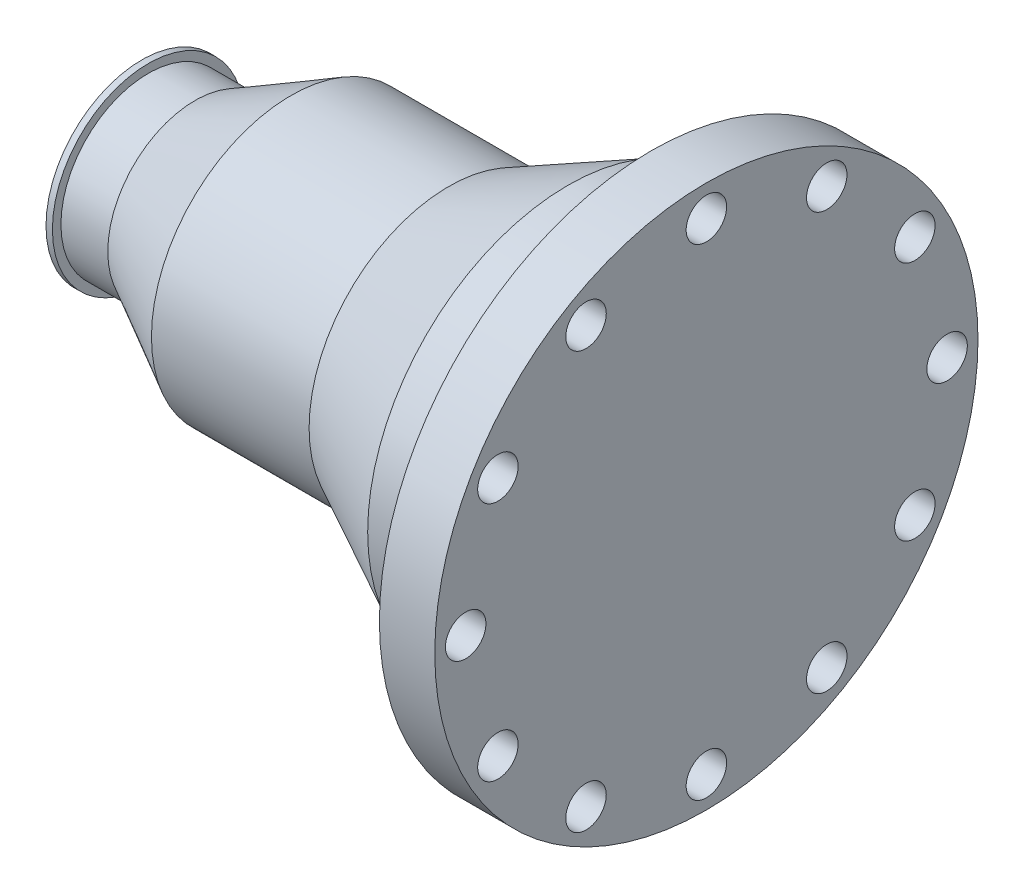
ISO-10303-21;
HEADER;
FILE_DESCRIPTION(('STEP AP214'),'2;1');
FILE_NAME('part.step','',(''),(''),'','','');
FILE_SCHEMA(('AUTOMOTIVE_DESIGN { 1 0 10303 214 1 1 1 1 }'));
ENDSEC;
DATA;
#1=APPLICATION_CONTEXT('core data for automotive mechanical design processes');
#2=APPLICATION_PROTOCOL_DEFINITION('international standard','automotive_design',2000,#1);
#3=PRODUCT_CONTEXT('',#1,'mechanical');
#4=PRODUCT('Part','Part','',(#3));
#5=PRODUCT_RELATED_PRODUCT_CATEGORY('part','',(#4));
#6=PRODUCT_DEFINITION_FORMATION('','',#4);
#7=PRODUCT_DEFINITION_CONTEXT('part definition',#1,'design');
#8=PRODUCT_DEFINITION('design','',#6,#7);
#9=PRODUCT_DEFINITION_SHAPE('','',#8);
#10=(LENGTH_UNIT() NAMED_UNIT(*) SI_UNIT(.MILLI.,.METRE.));
#11=(NAMED_UNIT(*) PLANE_ANGLE_UNIT() SI_UNIT($,.RADIAN.));
#12=(NAMED_UNIT(*) SI_UNIT($,.STERADIAN.) SOLID_ANGLE_UNIT());
#13=UNCERTAINTY_MEASURE_WITH_UNIT(LENGTH_MEASURE(1.E-05),#10,'distance_accuracy_value','');
#14=(GEOMETRIC_REPRESENTATION_CONTEXT(3) GLOBAL_UNCERTAINTY_ASSIGNED_CONTEXT((#13)) GLOBAL_UNIT_ASSIGNED_CONTEXT((#10,
#11,#12)) REPRESENTATION_CONTEXT('',''));
#15=CARTESIAN_POINT('',(0.,0.,0.));
#16=DIRECTION('',(0.,0.,1.));
#17=DIRECTION('',(1.,0.,0.));
#18=AXIS2_PLACEMENT_3D('',#15,#16,#17);
#19=CARTESIAN_POINT('',(0.,0.,0.));
#20=DIRECTION('',(1.,0.,0.));
#21=DIRECTION('',(0.,0.,-1.));
#22=AXIS2_PLACEMENT_3D('',#19,#20,#21);
#23=PLANE('',#22);
#24=CARTESIAN_POINT('',(0.,0.,0.));
#25=DIRECTION('',(-1.,0.,0.));
#26=DIRECTION('',(0.,0.,1.));
#27=AXIS2_PLACEMENT_3D('',#24,#25,#26);
#28=CIRCLE('',#27,31.);
#29=CARTESIAN_POINT('',(0.,0.,31.));
#30=VERTEX_POINT('',#29);
#31=EDGE_CURVE('E80',#30,#30,#28,.T.);
#32=ORIENTED_EDGE('',*,*,#31,.F.);
#33=EDGE_LOOP('',(#32));
#34=FACE_BOUND('',#33,.T.);
#35=CARTESIAN_POINT('',(0.,0.,0.));
#36=DIRECTION('',(-1.,0.,0.));
#37=DIRECTION('',(0.,0.,1.));
#38=AXIS2_PLACEMENT_3D('',#35,#36,#37);
#39=CIRCLE('',#38,45.);
#40=CARTESIAN_POINT('',(0.,0.,45.));
#41=VERTEX_POINT('',#40);
#42=EDGE_CURVE('E10',#41,#41,#39,.T.);
#43=ORIENTED_EDGE('',*,*,#42,.T.);
#44=EDGE_LOOP('',(#43));
#45=FACE_BOUND('',#44,.T.);
#46=ADVANCED_FACE('F37',(#34,#45),#23,.F.);
#47=CARTESIAN_POINT('',(0.,0.,0.));
#48=DIRECTION('',(-1.,0.,0.));
#49=DIRECTION('',(0.,0.,1.));
#50=AXIS2_PLACEMENT_3D('',#47,#48,#49);
#51=CYLINDRICAL_SURFACE('',#50,45.);
#52=ORIENTED_EDGE('',*,*,#42,.F.);
#53=EDGE_LOOP('',(#52));
#54=FACE_BOUND('',#53,.T.);
#55=CARTESIAN_POINT('',(3.,0.,0.));
#56=DIRECTION('',(-1.,0.,0.));
#57=DIRECTION('',(0.,0.,1.));
#58=AXIS2_PLACEMENT_3D('',#55,#56,#57);
#59=CIRCLE('',#58,45.);
#60=CARTESIAN_POINT('',(3.,0.,45.));
#61=VERTEX_POINT('',#60);
#62=EDGE_CURVE('E43',#61,#61,#59,.T.);
#63=ORIENTED_EDGE('',*,*,#62,.T.);
#64=EDGE_LOOP('',(#63));
#65=FACE_BOUND('',#64,.T.);
#66=ADVANCED_FACE('F205',(#54,#65),#51,.T.);
#67=CARTESIAN_POINT('',(3.,45.,0.));
#68=DIRECTION('',(-1.,0.,0.));
#69=DIRECTION('',(0.,0.,1.));
#70=AXIS2_PLACEMENT_3D('',#67,#68,#69);
#71=PLANE('',#70);
#72=ORIENTED_EDGE('',*,*,#62,.F.);
#73=EDGE_LOOP('',(#72));
#74=FACE_BOUND('',#73,.T.);
#75=CARTESIAN_POINT('',(3.,0.,0.));
#76=DIRECTION('',(-1.,0.,0.));
#77=DIRECTION('',(0.,0.,1.));
#78=AXIS2_PLACEMENT_3D('',#75,#76,#77);
#79=CIRCLE('',#78,41.);
#80=CARTESIAN_POINT('',(3.,0.,41.));
#81=VERTEX_POINT('',#80);
#82=EDGE_CURVE('E47',#81,#81,#79,.T.);
#83=ORIENTED_EDGE('',*,*,#82,.T.);
#84=EDGE_LOOP('',(#83));
#85=FACE_BOUND('',#84,.T.);
#86=ADVANCED_FACE('F211',(#74,#85),#71,.F.);
#87=CARTESIAN_POINT('',(0.,0.,0.));
#88=DIRECTION('',(-1.,0.,0.));
#89=DIRECTION('',(0.,0.,1.));
#90=AXIS2_PLACEMENT_3D('',#87,#88,#89);
#91=CYLINDRICAL_SURFACE('',#90,41.);
#92=ORIENTED_EDGE('',*,*,#82,.F.);
#93=EDGE_LOOP('',(#92));
#94=FACE_BOUND('',#93,.T.);
#95=CARTESIAN_POINT('',(25.,0.,0.));
#96=DIRECTION('',(-1.,0.,0.));
#97=DIRECTION('',(0.,0.,1.));
#98=AXIS2_PLACEMENT_3D('',#95,#96,#97);
#99=CIRCLE('',#98,41.);
#100=CARTESIAN_POINT('',(25.,0.,41.));
#101=VERTEX_POINT('',#100);
#102=EDGE_CURVE('E51',#101,#101,#99,.T.);
#103=ORIENTED_EDGE('',*,*,#102,.T.);
#104=EDGE_LOOP('',(#103));
#105=FACE_BOUND('',#104,.T.);
#106=ADVANCED_FACE('F409',(#94,#105),#91,.T.);
#107=CARTESIAN_POINT('',(70.,0.,0.));
#108=DIRECTION('',(1.,0.,0.));
#109=DIRECTION('',(0.,0.,-1.));
#110=AXIS2_PLACEMENT_3D('',#107,#108,#109);
#111=CONICAL_SURFACE('',#110,65.5,0.498567905638218);
#112=ORIENTED_EDGE('',*,*,#102,.F.);
#113=EDGE_LOOP('',(#112));
#114=FACE_BOUND('',#113,.T.);
#115=CARTESIAN_POINT('',(70.,0.,0.));
#116=DIRECTION('',(-1.,0.,0.));
#117=DIRECTION('',(0.,0.,1.));
#118=AXIS2_PLACEMENT_3D('',#115,#116,#117);
#119=CIRCLE('',#118,65.5);
#120=CARTESIAN_POINT('',(70.,0.,65.5));
#121=VERTEX_POINT('',#120);
#122=EDGE_CURVE('E56',#121,#121,#119,.T.);
#123=ORIENTED_EDGE('',*,*,#122,.T.);
#124=EDGE_LOOP('',(#123));
#125=FACE_BOUND('',#124,.T.);
#126=ADVANCED_FACE('F400',(#114,#125),#111,.T.);
#127=CARTESIAN_POINT('',(0.,0.,0.));
#128=DIRECTION('',(-1.,0.,0.));
#129=DIRECTION('',(0.,0.,1.));
#130=AXIS2_PLACEMENT_3D('',#127,#128,#129);
#131=CYLINDRICAL_SURFACE('',#130,65.5);
#132=ORIENTED_EDGE('',*,*,#122,.F.);
#133=EDGE_LOOP('',(#132));
#134=FACE_BOUND('',#133,.T.);
#135=CARTESIAN_POINT('',(144.,0.,0.));
#136=DIRECTION('',(-1.,0.,0.));
#137=DIRECTION('',(0.,0.,1.));
#138=AXIS2_PLACEMENT_3D('',#135,#136,#137);
#139=CIRCLE('',#138,65.5);
#140=CARTESIAN_POINT('',(144.,0.,65.5));
#141=VERTEX_POINT('',#140);
#142=EDGE_CURVE('E59',#141,#141,#139,.T.);
#143=ORIENTED_EDGE('',*,*,#142,.T.);
#144=EDGE_LOOP('',(#143));
#145=FACE_BOUND('',#144,.T.);
#146=ADVANCED_FACE('F391',(#134,#145),#131,.T.);
#147=CARTESIAN_POINT('',(200.,0.,0.));
#148=DIRECTION('',(1.,0.,0.));
#149=DIRECTION('',(0.,0.,-1.));
#150=AXIS2_PLACEMENT_3D('',#147,#148,#149);
#151=CONICAL_SURFACE('',#150,94.,0.470764926542016);
#152=ORIENTED_EDGE('',*,*,#142,.F.);
#153=EDGE_LOOP('',(#152));
#154=FACE_BOUND('',#153,.T.);
#155=CARTESIAN_POINT('',(200.,0.,0.));
#156=DIRECTION('',(-1.,0.,0.));
#157=DIRECTION('',(0.,0.,1.));
#158=AXIS2_PLACEMENT_3D('',#155,#156,#157);
#159=CIRCLE('',#158,94.);
#160=CARTESIAN_POINT('',(200.,0.,94.));
#161=VERTEX_POINT('',#160);
#162=EDGE_CURVE('E62',#161,#161,#159,.T.);
#163=ORIENTED_EDGE('',*,*,#162,.T.);
#164=EDGE_LOOP('',(#163));
#165=FACE_BOUND('',#164,.T.);
#166=ADVANCED_FACE('F382',(#154,#165),#151,.T.);
#167=CARTESIAN_POINT('',(0.,0.,0.));
#168=DIRECTION('',(-1.,0.,0.));
#169=DIRECTION('',(0.,0.,1.));
#170=AXIS2_PLACEMENT_3D('',#167,#168,#169);
#171=CYLINDRICAL_SURFACE('',#170,94.);
#172=ORIENTED_EDGE('',*,*,#162,.F.);
#173=EDGE_LOOP('',(#172));
#174=FACE_BOUND('',#173,.T.);
#175=CARTESIAN_POINT('',(220.,0.,0.));
#176=DIRECTION('',(-1.,0.,0.));
#177=DIRECTION('',(0.,0.,1.));
#178=AXIS2_PLACEMENT_3D('',#175,#176,#177);
#179=CIRCLE('',#178,94.);
#180=CARTESIAN_POINT('',(220.,0.,94.));
#181=VERTEX_POINT('',#180);
#182=EDGE_CURVE('E65',#181,#181,#179,.T.);
#183=ORIENTED_EDGE('',*,*,#182,.T.);
#184=EDGE_LOOP('',(#183));
#185=FACE_BOUND('',#184,.T.);
#186=ADVANCED_FACE('F373',(#174,#185),#171,.T.);
#187=CARTESIAN_POINT('',(220.,94.,0.));
#188=DIRECTION('',(1.,0.,0.));
#189=DIRECTION('',(0.,0.,-1.));
#190=AXIS2_PLACEMENT_3D('',#187,#188,#189);
#191=PLANE('',#190);
#192=ORIENTED_EDGE('',*,*,#182,.F.);
#193=EDGE_LOOP('',(#192));
#194=FACE_BOUND('',#193,.T.);
#195=CARTESIAN_POINT('',(220.,0.,0.));
#196=DIRECTION('',(-1.,0.,0.));
#197=DIRECTION('',(0.,0.,1.));
#198=AXIS2_PLACEMENT_3D('',#195,#196,#197);
#199=CIRCLE('',#198,95.);
#200=CARTESIAN_POINT('',(220.,0.,95.));
#201=VERTEX_POINT('',#200);
#202=EDGE_CURVE('E68',#201,#201,#199,.T.);
#203=ORIENTED_EDGE('',*,*,#202,.T.);
#204=EDGE_LOOP('',(#203));
#205=FACE_BOUND('',#204,.T.);
#206=ADVANCED_FACE('F364',(#194,#205),#191,.F.);
#207=CARTESIAN_POINT('',(0.,0.,0.));
#208=DIRECTION('',(-1.,0.,0.));
#209=DIRECTION('',(0.,0.,1.));
#210=AXIS2_PLACEMENT_3D('',#207,#208,#209);
#211=CYLINDRICAL_SURFACE('',#210,95.);
#212=ORIENTED_EDGE('',*,*,#202,.F.);
#213=EDGE_LOOP('',(#212));
#214=FACE_BOUND('',#213,.T.);
#215=CARTESIAN_POINT('',(239.,0.,0.));
#216=DIRECTION('',(-1.,0.,0.));
#217=DIRECTION('',(0.,0.,1.));
#218=AXIS2_PLACEMENT_3D('',#215,#216,#217);
#219=CIRCLE('',#218,95.);
#220=CARTESIAN_POINT('',(239.,0.,95.));
#221=VERTEX_POINT('',#220);
#222=EDGE_CURVE('E71',#221,#221,#219,.T.);
#223=ORIENTED_EDGE('',*,*,#222,.T.);
#224=EDGE_LOOP('',(#223));
#225=FACE_BOUND('',#224,.T.);
#226=ADVANCED_FACE('F201',(#214,#225),#211,.T.);
#227=CARTESIAN_POINT('',(239.,100.,0.));
#228=DIRECTION('',(1.,0.,0.));
#229=DIRECTION('',(0.,0.,-1.));
#230=AXIS2_PLACEMENT_3D('',#227,#228,#229);
#231=PLANE('',#230);
#232=CARTESIAN_POINT('',(239.,97.8608706276416,-56.5));
#233=DIRECTION('',(1.,0.,0.));
#234=DIRECTION('',(0.,0.,-1.));
#235=AXIS2_PLACEMENT_3D('',#232,#233,#234);
#236=CIRCLE('',#235,9.50000000000001);
#237=CARTESIAN_POINT('',(239.,97.8608706276416,-66.));
#238=VERTEX_POINT('',#237);
#239=EDGE_CURVE('E152',#238,#238,#236,.F.);
#240=ORIENTED_EDGE('',*,*,#239,.F.);
#241=EDGE_LOOP('',(#240));
#242=FACE_BOUND('',#241,.T.);
#243=CARTESIAN_POINT('',(239.,56.4999999999999,-97.8608706276416));
#244=DIRECTION('',(1.,0.,0.));
#245=DIRECTION('',(0.,0.,-1.));
#246=AXIS2_PLACEMENT_3D('',#243,#244,#245);
#247=CIRCLE('',#246,9.5);
#248=CARTESIAN_POINT('',(239.,56.4999999999999,-107.360870627642));
#249=VERTEX_POINT('',#248);
#250=EDGE_CURVE('E146',#249,#249,#247,.F.);
#251=ORIENTED_EDGE('',*,*,#250,.F.);
#252=EDGE_LOOP('',(#251));
#253=FACE_BOUND('',#252,.T.);
#254=CARTESIAN_POINT('',(239.,0.,-113.));
#255=DIRECTION('',(1.,0.,0.));
#256=DIRECTION('',(0.,0.,-1.));
#257=AXIS2_PLACEMENT_3D('',#254,#255,#256);
#258=CIRCLE('',#257,9.49999999999999);
#259=CARTESIAN_POINT('',(239.,0.,-122.5));
#260=VERTEX_POINT('',#259);
#261=EDGE_CURVE('E140',#260,#260,#258,.F.);
#262=ORIENTED_EDGE('',*,*,#261,.F.);
#263=EDGE_LOOP('',(#262));
#264=FACE_BOUND('',#263,.T.);
#265=CARTESIAN_POINT('',(239.,-56.5,-97.8608706276415));
#266=DIRECTION('',(1.,0.,0.));
#267=DIRECTION('',(0.,0.,-1.));
#268=AXIS2_PLACEMENT_3D('',#265,#266,#267);
#269=CIRCLE('',#268,9.5);
#270=CARTESIAN_POINT('',(239.,-56.5,-107.360870627642));
#271=VERTEX_POINT('',#270);
#272=EDGE_CURVE('E134',#271,#271,#269,.F.);
#273=ORIENTED_EDGE('',*,*,#272,.F.);
#274=EDGE_LOOP('',(#273));
#275=FACE_BOUND('',#274,.T.);
#276=CARTESIAN_POINT('',(239.,-97.8608706276416,-56.5));
#277=DIRECTION('',(1.,0.,0.));
#278=DIRECTION('',(0.,0.,-1.));
#279=AXIS2_PLACEMENT_3D('',#276,#277,#278);
#280=CIRCLE('',#279,9.50000000000001);
#281=CARTESIAN_POINT('',(239.,-97.8608706276416,-66.));
#282=VERTEX_POINT('',#281);
#283=EDGE_CURVE('E128',#282,#282,#280,.F.);
#284=ORIENTED_EDGE('',*,*,#283,.F.);
#285=EDGE_LOOP('',(#284));
#286=FACE_BOUND('',#285,.T.);
#287=CARTESIAN_POINT('',(239.,-113.,0.));
#288=DIRECTION('',(1.,0.,0.));
#289=DIRECTION('',(0.,0.,-1.));
#290=AXIS2_PLACEMENT_3D('',#287,#288,#289);
#291=CIRCLE('',#290,9.49999999999998);
#292=CARTESIAN_POINT('',(239.,-113.,-9.49999999999998));
#293=VERTEX_POINT('',#292);
#294=EDGE_CURVE('E122',#293,#293,#291,.F.);
#295=ORIENTED_EDGE('',*,*,#294,.F.);
#296=EDGE_LOOP('',(#295));
#297=FACE_BOUND('',#296,.T.);
#298=CARTESIAN_POINT('',(239.,-97.8608706276415,56.5));
#299=DIRECTION('',(1.,0.,0.));
#300=DIRECTION('',(0.,0.,-1.));
#301=AXIS2_PLACEMENT_3D('',#298,#299,#300);
#302=CIRCLE('',#301,9.5);
#303=CARTESIAN_POINT('',(239.,-97.8608706276415,47.));
#304=VERTEX_POINT('',#303);
#305=EDGE_CURVE('E116',#304,#304,#302,.F.);
#306=ORIENTED_EDGE('',*,*,#305,.F.);
#307=EDGE_LOOP('',(#306));
#308=FACE_BOUND('',#307,.T.);
#309=CARTESIAN_POINT('',(239.,-56.5,97.8608706276416));
#310=DIRECTION('',(1.,0.,0.));
#311=DIRECTION('',(0.,0.,-1.));
#312=AXIS2_PLACEMENT_3D('',#309,#310,#311);
#313=CIRCLE('',#312,9.5);
#314=CARTESIAN_POINT('',(239.,-56.5,88.3608706276416));
#315=VERTEX_POINT('',#314);
#316=EDGE_CURVE('E110',#315,#315,#313,.F.);
#317=ORIENTED_EDGE('',*,*,#316,.F.);
#318=EDGE_LOOP('',(#317));
#319=FACE_BOUND('',#318,.T.);
#320=CARTESIAN_POINT('',(239.,0.,113.));
#321=DIRECTION('',(1.,0.,0.));
#322=DIRECTION('',(0.,0.,-1.));
#323=AXIS2_PLACEMENT_3D('',#320,#321,#322);
#324=CIRCLE('',#323,9.49999999999999);
#325=CARTESIAN_POINT('',(239.,0.,103.5));
#326=VERTEX_POINT('',#325);
#327=EDGE_CURVE('E104',#326,#326,#324,.F.);
#328=ORIENTED_EDGE('',*,*,#327,.F.);
#329=EDGE_LOOP('',(#328));
#330=FACE_BOUND('',#329,.T.);
#331=CARTESIAN_POINT('',(239.,56.5,97.8608706276416));
#332=DIRECTION('',(1.,0.,0.));
#333=DIRECTION('',(0.,0.,-1.));
#334=AXIS2_PLACEMENT_3D('',#331,#332,#333);
#335=CIRCLE('',#334,9.5);
#336=CARTESIAN_POINT('',(239.,56.5,88.3608706276416));
#337=VERTEX_POINT('',#336);
#338=EDGE_CURVE('E98',#337,#337,#335,.F.);
#339=ORIENTED_EDGE('',*,*,#338,.F.);
#340=EDGE_LOOP('',(#339));
#341=FACE_BOUND('',#340,.T.);
#342=CARTESIAN_POINT('',(239.,97.8608706276416,56.5));
#343=DIRECTION('',(1.,0.,0.));
#344=DIRECTION('',(0.,0.,-1.));
#345=AXIS2_PLACEMENT_3D('',#342,#343,#344);
#346=CIRCLE('',#345,9.5);
#347=CARTESIAN_POINT('',(239.,97.8608706276416,47.));
#348=VERTEX_POINT('',#347);
#349=EDGE_CURVE('E92',#348,#348,#346,.F.);
#350=ORIENTED_EDGE('',*,*,#349,.F.);
#351=EDGE_LOOP('',(#350));
#352=FACE_BOUND('',#351,.T.);
#353=CARTESIAN_POINT('',(239.,113.,0.));
#354=DIRECTION('',(1.,0.,0.));
#355=DIRECTION('',(0.,0.,-1.));
#356=AXIS2_PLACEMENT_3D('',#353,#354,#355);
#357=CIRCLE('',#356,9.50000000000001);
#358=CARTESIAN_POINT('',(239.,113.,-9.50000000000001));
#359=VERTEX_POINT('',#358);
#360=EDGE_CURVE('E86',#359,#359,#357,.F.);
#361=ORIENTED_EDGE('',*,*,#360,.F.);
#362=EDGE_LOOP('',(#361));
#363=FACE_BOUND('',#362,.T.);
#364=ORIENTED_EDGE('',*,*,#222,.F.);
#365=EDGE_LOOP('',(#364));
#366=FACE_BOUND('',#365,.T.);
#367=CARTESIAN_POINT('',(239.,0.,0.));
#368=DIRECTION('',(-1.,0.,0.));
#369=DIRECTION('',(0.,0.,1.));
#370=AXIS2_PLACEMENT_3D('',#367,#368,#369);
#371=CIRCLE('',#370,127.5);
#372=CARTESIAN_POINT('',(239.,0.,127.5));
#373=VERTEX_POINT('',#372);
#374=EDGE_CURVE('E74',#373,#373,#371,.T.);
#375=ORIENTED_EDGE('',*,*,#374,.T.);
#376=EDGE_LOOP('',(#375));
#377=FACE_BOUND('',#376,.T.);
#378=ADVANCED_FACE('F193',(#242,#253,#264,#275,#286,#297,#308,#319,#330,#341,#352,#363,#366,
#377),#231,.F.);
#379=CARTESIAN_POINT('',(0.,0.,0.));
#380=DIRECTION('',(-1.,0.,0.));
#381=DIRECTION('',(0.,0.,1.));
#382=AXIS2_PLACEMENT_3D('',#379,#380,#381);
#383=CYLINDRICAL_SURFACE('',#382,127.5);
#384=ORIENTED_EDGE('',*,*,#374,.F.);
#385=EDGE_LOOP('',(#384));
#386=FACE_BOUND('',#385,.T.);
#387=CARTESIAN_POINT('',(265.,0.,0.));
#388=DIRECTION('',(-1.,0.,0.));
#389=DIRECTION('',(0.,0.,1.));
#390=AXIS2_PLACEMENT_3D('',#387,#388,#389);
#391=CIRCLE('',#390,127.5);
#392=CARTESIAN_POINT('',(265.,0.,127.5));
#393=VERTEX_POINT('',#392);
#394=EDGE_CURVE('E77',#393,#393,#391,.T.);
#395=ORIENTED_EDGE('',*,*,#394,.T.);
#396=EDGE_LOOP('',(#395));
#397=FACE_BOUND('',#396,.T.);
#398=ADVANCED_FACE('F166',(#386,#397),#383,.T.);
#399=CARTESIAN_POINT('',(265.,127.5,0.));
#400=DIRECTION('',(-1.,0.,0.));
#401=DIRECTION('',(0.,0.,1.));
#402=AXIS2_PLACEMENT_3D('',#399,#400,#401);
#403=PLANE('',#402);
#404=CARTESIAN_POINT('',(265.,97.8608706276416,-56.5));
#405=DIRECTION('',(1.,0.,0.));
#406=DIRECTION('',(0.,0.,-1.));
#407=AXIS2_PLACEMENT_3D('',#404,#405,#406);
#408=CIRCLE('',#407,9.50000000000001);
#409=CARTESIAN_POINT('',(265.,97.8608706276416,-66.));
#410=VERTEX_POINT('',#409);
#411=EDGE_CURVE('E155',#410,#410,#408,.T.);
#412=ORIENTED_EDGE('',*,*,#411,.F.);
#413=EDGE_LOOP('',(#412));
#414=FACE_BOUND('',#413,.T.);
#415=CARTESIAN_POINT('',(265.,56.4999999999999,-97.8608706276416));
#416=DIRECTION('',(1.,0.,0.));
#417=DIRECTION('',(0.,0.,-1.));
#418=AXIS2_PLACEMENT_3D('',#415,#416,#417);
#419=CIRCLE('',#418,9.5);
#420=CARTESIAN_POINT('',(265.,56.4999999999999,-107.360870627642));
#421=VERTEX_POINT('',#420);
#422=EDGE_CURVE('E149',#421,#421,#419,.T.);
#423=ORIENTED_EDGE('',*,*,#422,.F.);
#424=EDGE_LOOP('',(#423));
#425=FACE_BOUND('',#424,.T.);
#426=CARTESIAN_POINT('',(265.,0.,-113.));
#427=DIRECTION('',(1.,0.,0.));
#428=DIRECTION('',(0.,0.,-1.));
#429=AXIS2_PLACEMENT_3D('',#426,#427,#428);
#430=CIRCLE('',#429,9.49999999999999);
#431=CARTESIAN_POINT('',(265.,0.,-122.5));
#432=VERTEX_POINT('',#431);
#433=EDGE_CURVE('E143',#432,#432,#430,.T.);
#434=ORIENTED_EDGE('',*,*,#433,.F.);
#435=EDGE_LOOP('',(#434));
#436=FACE_BOUND('',#435,.T.);
#437=CARTESIAN_POINT('',(265.,-56.5,-97.8608706276415));
#438=DIRECTION('',(1.,0.,0.));
#439=DIRECTION('',(0.,0.,-1.));
#440=AXIS2_PLACEMENT_3D('',#437,#438,#439);
#441=CIRCLE('',#440,9.5);
#442=CARTESIAN_POINT('',(265.,-56.5,-107.360870627642));
#443=VERTEX_POINT('',#442);
#444=EDGE_CURVE('E137',#443,#443,#441,.T.);
#445=ORIENTED_EDGE('',*,*,#444,.F.);
#446=EDGE_LOOP('',(#445));
#447=FACE_BOUND('',#446,.T.);
#448=CARTESIAN_POINT('',(265.,-97.8608706276416,-56.5));
#449=DIRECTION('',(1.,0.,0.));
#450=DIRECTION('',(0.,0.,-1.));
#451=AXIS2_PLACEMENT_3D('',#448,#449,#450);
#452=CIRCLE('',#451,9.50000000000001);
#453=CARTESIAN_POINT('',(265.,-97.8608706276416,-66.));
#454=VERTEX_POINT('',#453);
#455=EDGE_CURVE('E131',#454,#454,#452,.T.);
#456=ORIENTED_EDGE('',*,*,#455,.F.);
#457=EDGE_LOOP('',(#456));
#458=FACE_BOUND('',#457,.T.);
#459=CARTESIAN_POINT('',(265.,-113.,0.));
#460=DIRECTION('',(1.,0.,0.));
#461=DIRECTION('',(0.,0.,-1.));
#462=AXIS2_PLACEMENT_3D('',#459,#460,#461);
#463=CIRCLE('',#462,9.49999999999998);
#464=CARTESIAN_POINT('',(265.,-113.,-9.49999999999998));
#465=VERTEX_POINT('',#464);
#466=EDGE_CURVE('E125',#465,#465,#463,.T.);
#467=ORIENTED_EDGE('',*,*,#466,.F.);
#468=EDGE_LOOP('',(#467));
#469=FACE_BOUND('',#468,.T.);
#470=CARTESIAN_POINT('',(265.,-97.8608706276415,56.5));
#471=DIRECTION('',(1.,0.,0.));
#472=DIRECTION('',(0.,0.,-1.));
#473=AXIS2_PLACEMENT_3D('',#470,#471,#472);
#474=CIRCLE('',#473,9.5);
#475=CARTESIAN_POINT('',(265.,-97.8608706276415,47.));
#476=VERTEX_POINT('',#475);
#477=EDGE_CURVE('E119',#476,#476,#474,.T.);
#478=ORIENTED_EDGE('',*,*,#477,.F.);
#479=EDGE_LOOP('',(#478));
#480=FACE_BOUND('',#479,.T.);
#481=CARTESIAN_POINT('',(265.,-56.5,97.8608706276416));
#482=DIRECTION('',(1.,0.,0.));
#483=DIRECTION('',(0.,0.,-1.));
#484=AXIS2_PLACEMENT_3D('',#481,#482,#483);
#485=CIRCLE('',#484,9.5);
#486=CARTESIAN_POINT('',(265.,-56.5,88.3608706276416));
#487=VERTEX_POINT('',#486);
#488=EDGE_CURVE('E113',#487,#487,#485,.T.);
#489=ORIENTED_EDGE('',*,*,#488,.F.);
#490=EDGE_LOOP('',(#489));
#491=FACE_BOUND('',#490,.T.);
#492=CARTESIAN_POINT('',(265.,0.,113.));
#493=DIRECTION('',(1.,0.,0.));
#494=DIRECTION('',(0.,0.,-1.));
#495=AXIS2_PLACEMENT_3D('',#492,#493,#494);
#496=CIRCLE('',#495,9.49999999999999);
#497=CARTESIAN_POINT('',(265.,0.,103.5));
#498=VERTEX_POINT('',#497);
#499=EDGE_CURVE('E107',#498,#498,#496,.T.);
#500=ORIENTED_EDGE('',*,*,#499,.F.);
#501=EDGE_LOOP('',(#500));
#502=FACE_BOUND('',#501,.T.);
#503=CARTESIAN_POINT('',(265.,56.5,97.8608706276416));
#504=DIRECTION('',(1.,0.,0.));
#505=DIRECTION('',(0.,0.,-1.));
#506=AXIS2_PLACEMENT_3D('',#503,#504,#505);
#507=CIRCLE('',#506,9.5);
#508=CARTESIAN_POINT('',(265.,56.5,88.3608706276416));
#509=VERTEX_POINT('',#508);
#510=EDGE_CURVE('E101',#509,#509,#507,.T.);
#511=ORIENTED_EDGE('',*,*,#510,.F.);
#512=EDGE_LOOP('',(#511));
#513=FACE_BOUND('',#512,.T.);
#514=CARTESIAN_POINT('',(265.,97.8608706276416,56.5));
#515=DIRECTION('',(1.,0.,0.));
#516=DIRECTION('',(0.,0.,-1.));
#517=AXIS2_PLACEMENT_3D('',#514,#515,#516);
#518=CIRCLE('',#517,9.5);
#519=CARTESIAN_POINT('',(265.,97.8608706276416,47.));
#520=VERTEX_POINT('',#519);
#521=EDGE_CURVE('E95',#520,#520,#518,.T.);
#522=ORIENTED_EDGE('',*,*,#521,.F.);
#523=EDGE_LOOP('',(#522));
#524=FACE_BOUND('',#523,.T.);
#525=CARTESIAN_POINT('',(265.,113.,0.));
#526=DIRECTION('',(1.,0.,0.));
#527=DIRECTION('',(0.,0.,-1.));
#528=AXIS2_PLACEMENT_3D('',#525,#526,#527);
#529=CIRCLE('',#528,9.50000000000001);
#530=CARTESIAN_POINT('',(265.,113.,-9.50000000000001));
#531=VERTEX_POINT('',#530);
#532=EDGE_CURVE('E89',#531,#531,#529,.T.);
#533=ORIENTED_EDGE('',*,*,#532,.F.);
#534=EDGE_LOOP('',(#533));
#535=FACE_BOUND('',#534,.T.);
#536=ORIENTED_EDGE('',*,*,#394,.F.);
#537=EDGE_LOOP('',(#536));
#538=FACE_BOUND('',#537,.T.);
#539=ADVANCED_FACE('F162',(#414,#425,#436,#447,#458,#469,#480,#491,#502,#513,#524,#535,#538),
#403,.F.);
#540=CARTESIAN_POINT('',(0.,0.,0.));
#541=DIRECTION('',(-1.,0.,0.));
#542=DIRECTION('',(0.,0.,1.));
#543=AXIS2_PLACEMENT_3D('',#540,#541,#542);
#544=CYLINDRICAL_SURFACE('',#543,31.);
#545=ORIENTED_EDGE('',*,*,#31,.T.);
#546=EDGE_LOOP('',(#545));
#547=FACE_BOUND('',#546,.T.);
#548=CARTESIAN_POINT('',(38.,0.,0.));
#549=DIRECTION('',(-1.,0.,0.));
#550=DIRECTION('',(0.,0.,1.));
#551=AXIS2_PLACEMENT_3D('',#548,#549,#550);
#552=CIRCLE('',#551,31.);
#553=CARTESIAN_POINT('',(38.,0.,31.));
#554=VERTEX_POINT('',#553);
#555=EDGE_CURVE('E83',#554,#554,#552,.T.);
#556=ORIENTED_EDGE('',*,*,#555,.F.);
#557=EDGE_LOOP('',(#556));
#558=FACE_BOUND('',#557,.T.);
#559=ADVANCED_FACE('F165',(#547,#558),#544,.F.);
#560=CARTESIAN_POINT('',(38.,31.,0.));
#561=DIRECTION('',(-1.,0.,0.));
#562=DIRECTION('',(0.,0.,1.));
#563=AXIS2_PLACEMENT_3D('',#560,#561,#562);
#564=PLANE('',#563);
#565=ORIENTED_EDGE('',*,*,#555,.T.);
#566=EDGE_LOOP('',(#565));
#567=FACE_BOUND('',#566,.T.);
#568=ADVANCED_FACE('F216',(#567),#564,.T.);
#569=CARTESIAN_POINT('',(265.,113.,0.));
#570=DIRECTION('',(-1.,0.,0.));
#571=DIRECTION('',(0.,0.,1.));
#572=AXIS2_PLACEMENT_3D('',#569,#570,#571);
#573=CYLINDRICAL_SURFACE('',#572,9.50000000000001);
#574=ORIENTED_EDGE('',*,*,#532,.T.);
#575=EDGE_LOOP('',(#574));
#576=FACE_BOUND('',#575,.T.);
#577=ORIENTED_EDGE('',*,*,#360,.T.);
#578=EDGE_LOOP('',(#577));
#579=FACE_BOUND('',#578,.T.);
#580=ADVANCED_FACE('F221',(#576,#579),#573,.F.);
#581=CARTESIAN_POINT('',(265.,97.8608706276416,56.5));
#582=DIRECTION('',(-1.,0.,0.));
#583=DIRECTION('',(0.,0.,1.));
#584=AXIS2_PLACEMENT_3D('',#581,#582,#583);
#585=CYLINDRICAL_SURFACE('',#584,9.5);
#586=ORIENTED_EDGE('',*,*,#521,.T.);
#587=EDGE_LOOP('',(#586));
#588=FACE_BOUND('',#587,.T.);
#589=ORIENTED_EDGE('',*,*,#349,.T.);
#590=EDGE_LOOP('',(#589));
#591=FACE_BOUND('',#590,.T.);
#592=ADVANCED_FACE('F226',(#588,#591),#585,.F.);
#593=CARTESIAN_POINT('',(265.,56.5,97.8608706276416));
#594=DIRECTION('',(-1.,0.,0.));
#595=DIRECTION('',(0.,0.,1.));
#596=AXIS2_PLACEMENT_3D('',#593,#594,#595);
#597=CYLINDRICAL_SURFACE('',#596,9.5);
#598=ORIENTED_EDGE('',*,*,#510,.T.);
#599=EDGE_LOOP('',(#598));
#600=FACE_BOUND('',#599,.T.);
#601=ORIENTED_EDGE('',*,*,#338,.T.);
#602=EDGE_LOOP('',(#601));
#603=FACE_BOUND('',#602,.T.);
#604=ADVANCED_FACE('F232',(#600,#603),#597,.F.);
#605=CARTESIAN_POINT('',(265.,0.,113.));
#606=DIRECTION('',(-1.,0.,0.));
#607=DIRECTION('',(0.,0.,1.));
#608=AXIS2_PLACEMENT_3D('',#605,#606,#607);
#609=CYLINDRICAL_SURFACE('',#608,9.49999999999999);
#610=ORIENTED_EDGE('',*,*,#499,.T.);
#611=EDGE_LOOP('',(#610));
#612=FACE_BOUND('',#611,.T.);
#613=ORIENTED_EDGE('',*,*,#327,.T.);
#614=EDGE_LOOP('',(#613));
#615=FACE_BOUND('',#614,.T.);
#616=ADVANCED_FACE('F236',(#612,#615),#609,.F.);
#617=CARTESIAN_POINT('',(265.,-56.5,97.8608706276416));
#618=DIRECTION('',(-1.,0.,0.));
#619=DIRECTION('',(0.,0.,1.));
#620=AXIS2_PLACEMENT_3D('',#617,#618,#619);
#621=CYLINDRICAL_SURFACE('',#620,9.5);
#622=ORIENTED_EDGE('',*,*,#488,.T.);
#623=EDGE_LOOP('',(#622));
#624=FACE_BOUND('',#623,.T.);
#625=ORIENTED_EDGE('',*,*,#316,.T.);
#626=EDGE_LOOP('',(#625));
#627=FACE_BOUND('',#626,.T.);
#628=ADVANCED_FACE('F240',(#624,#627),#621,.F.);
#629=CARTESIAN_POINT('',(265.,-97.8608706276415,56.5));
#630=DIRECTION('',(-1.,0.,0.));
#631=DIRECTION('',(0.,0.,1.));
#632=AXIS2_PLACEMENT_3D('',#629,#630,#631);
#633=CYLINDRICAL_SURFACE('',#632,9.5);
#634=ORIENTED_EDGE('',*,*,#477,.T.);
#635=EDGE_LOOP('',(#634));
#636=FACE_BOUND('',#635,.T.);
#637=ORIENTED_EDGE('',*,*,#305,.T.);
#638=EDGE_LOOP('',(#637));
#639=FACE_BOUND('',#638,.T.);
#640=ADVANCED_FACE('F244',(#636,#639),#633,.F.);
#641=CARTESIAN_POINT('',(265.,-113.,0.));
#642=DIRECTION('',(-1.,0.,0.));
#643=DIRECTION('',(0.,0.,1.));
#644=AXIS2_PLACEMENT_3D('',#641,#642,#643);
#645=CYLINDRICAL_SURFACE('',#644,9.49999999999998);
#646=ORIENTED_EDGE('',*,*,#466,.T.);
#647=EDGE_LOOP('',(#646));
#648=FACE_BOUND('',#647,.T.);
#649=ORIENTED_EDGE('',*,*,#294,.T.);
#650=EDGE_LOOP('',(#649));
#651=FACE_BOUND('',#650,.T.);
#652=ADVANCED_FACE('F248',(#648,#651),#645,.F.);
#653=CARTESIAN_POINT('',(265.,-97.8608706276416,-56.5));
#654=DIRECTION('',(-1.,0.,0.));
#655=DIRECTION('',(0.,0.,1.));
#656=AXIS2_PLACEMENT_3D('',#653,#654,#655);
#657=CYLINDRICAL_SURFACE('',#656,9.50000000000001);
#658=ORIENTED_EDGE('',*,*,#455,.T.);
#659=EDGE_LOOP('',(#658));
#660=FACE_BOUND('',#659,.T.);
#661=ORIENTED_EDGE('',*,*,#283,.T.);
#662=EDGE_LOOP('',(#661));
#663=FACE_BOUND('',#662,.T.);
#664=ADVANCED_FACE('F252',(#660,#663),#657,.F.);
#665=CARTESIAN_POINT('',(265.,-56.5,-97.8608706276415));
#666=DIRECTION('',(-1.,0.,0.));
#667=DIRECTION('',(0.,0.,1.));
#668=AXIS2_PLACEMENT_3D('',#665,#666,#667);
#669=CYLINDRICAL_SURFACE('',#668,9.5);
#670=ORIENTED_EDGE('',*,*,#444,.T.);
#671=EDGE_LOOP('',(#670));
#672=FACE_BOUND('',#671,.T.);
#673=ORIENTED_EDGE('',*,*,#272,.T.);
#674=EDGE_LOOP('',(#673));
#675=FACE_BOUND('',#674,.T.);
#676=ADVANCED_FACE('F256',(#672,#675),#669,.F.);
#677=CARTESIAN_POINT('',(265.,0.,-113.));
#678=DIRECTION('',(-1.,0.,0.));
#679=DIRECTION('',(0.,0.,1.));
#680=AXIS2_PLACEMENT_3D('',#677,#678,#679);
#681=CYLINDRICAL_SURFACE('',#680,9.49999999999999);
#682=ORIENTED_EDGE('',*,*,#433,.T.);
#683=EDGE_LOOP('',(#682));
#684=FACE_BOUND('',#683,.T.);
#685=ORIENTED_EDGE('',*,*,#261,.T.);
#686=EDGE_LOOP('',(#685));
#687=FACE_BOUND('',#686,.T.);
#688=ADVANCED_FACE('F260',(#684,#687),#681,.F.);
#689=CARTESIAN_POINT('',(265.,56.4999999999999,-97.8608706276416));
#690=DIRECTION('',(-1.,0.,0.));
#691=DIRECTION('',(0.,0.,1.));
#692=AXIS2_PLACEMENT_3D('',#689,#690,#691);
#693=CYLINDRICAL_SURFACE('',#692,9.5);
#694=ORIENTED_EDGE('',*,*,#422,.T.);
#695=EDGE_LOOP('',(#694));
#696=FACE_BOUND('',#695,.T.);
#697=ORIENTED_EDGE('',*,*,#250,.T.);
#698=EDGE_LOOP('',(#697));
#699=FACE_BOUND('',#698,.T.);
#700=ADVANCED_FACE('F264',(#696,#699),#693,.F.);
#701=CARTESIAN_POINT('',(265.,97.8608706276416,-56.5));
#702=DIRECTION('',(-1.,0.,0.));
#703=DIRECTION('',(0.,0.,1.));
#704=AXIS2_PLACEMENT_3D('',#701,#702,#703);
#705=CYLINDRICAL_SURFACE('',#704,9.50000000000001);
#706=ORIENTED_EDGE('',*,*,#411,.T.);
#707=EDGE_LOOP('',(#706));
#708=FACE_BOUND('',#707,.T.);
#709=ORIENTED_EDGE('',*,*,#239,.T.);
#710=EDGE_LOOP('',(#709));
#711=FACE_BOUND('',#710,.T.);
#712=ADVANCED_FACE('F159',(#708,#711),#705,.F.);
#713=CLOSED_SHELL('',(#46,#66,#86,#106,#126,#146,#166,#186,#206,#226,#378,#398,#539,#559,#568,
#580,#592,#604,#616,#628,#640,#652,#664,#676,#688,#700,#712));
#714=MANIFOLD_SOLID_BREP('B2',#713);
#715=ADVANCED_BREP_SHAPE_REPRESENTATION('',(#18,#714),#14);
#716=SHAPE_DEFINITION_REPRESENTATION(#9,#715);
ENDSEC;
END-ISO-10303-21;
